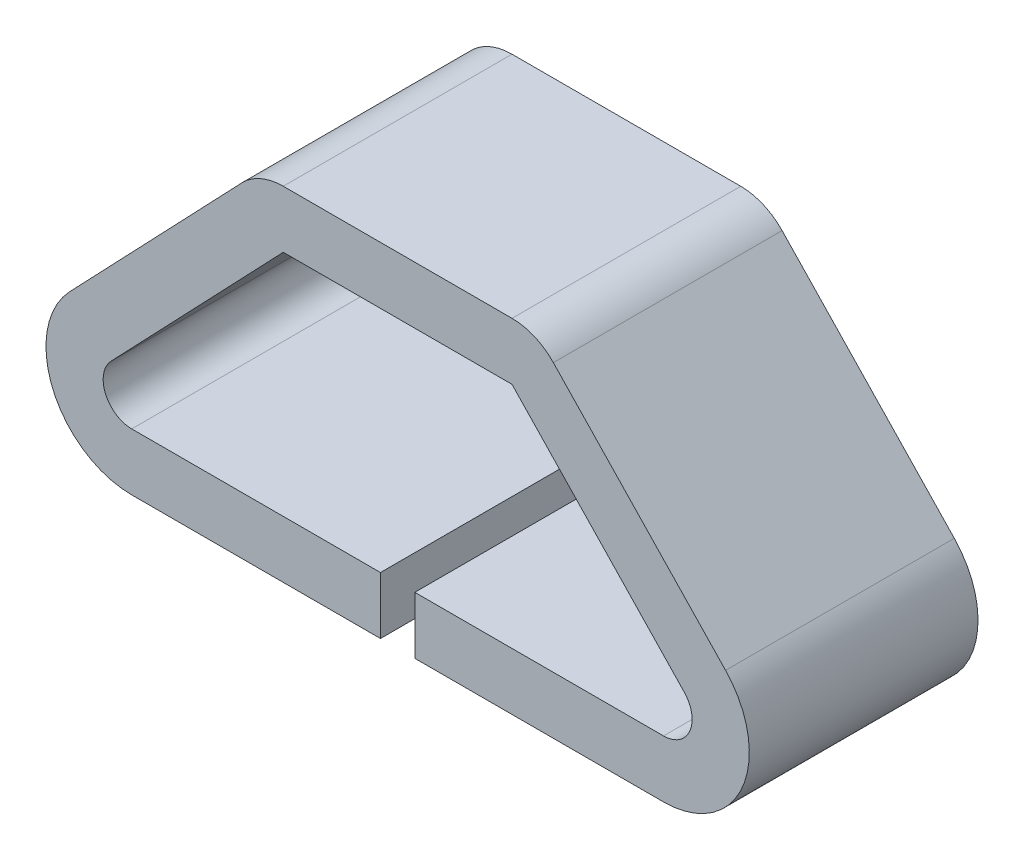
ISO-10303-21;
HEADER;
FILE_DESCRIPTION(('STEP AP214'),'2;1');
FILE_NAME('part.step','',(''),(''),'','','');
FILE_SCHEMA(('AUTOMOTIVE_DESIGN { 1 0 10303 214 1 1 1 1 }'));
ENDSEC;
DATA;
#1=APPLICATION_CONTEXT('core data for automotive mechanical design processes');
#2=APPLICATION_PROTOCOL_DEFINITION('international standard','automotive_design',2000,#1);
#3=PRODUCT_CONTEXT('',#1,'mechanical');
#4=PRODUCT('Part','Part','',(#3));
#5=PRODUCT_RELATED_PRODUCT_CATEGORY('part','',(#4));
#6=PRODUCT_DEFINITION_FORMATION('','',#4);
#7=PRODUCT_DEFINITION_CONTEXT('part definition',#1,'design');
#8=PRODUCT_DEFINITION('design','',#6,#7);
#9=PRODUCT_DEFINITION_SHAPE('','',#8);
#10=(LENGTH_UNIT() NAMED_UNIT(*) SI_UNIT(.MILLI.,.METRE.));
#11=(NAMED_UNIT(*) PLANE_ANGLE_UNIT() SI_UNIT($,.RADIAN.));
#12=(NAMED_UNIT(*) SI_UNIT($,.STERADIAN.) SOLID_ANGLE_UNIT());
#13=UNCERTAINTY_MEASURE_WITH_UNIT(LENGTH_MEASURE(1.E-05),#10,'distance_accuracy_value','');
#14=(GEOMETRIC_REPRESENTATION_CONTEXT(3) GLOBAL_UNCERTAINTY_ASSIGNED_CONTEXT((#13)) GLOBAL_UNIT_ASSIGNED_CONTEXT((#10,
#11,#12)) REPRESENTATION_CONTEXT('',''));
#15=CARTESIAN_POINT('',(0.,0.,0.));
#16=DIRECTION('',(0.,0.,1.));
#17=DIRECTION('',(1.,0.,0.));
#18=AXIS2_PLACEMENT_3D('',#15,#16,#17);
#19=CARTESIAN_POINT('',(1.1811,0.,-0.508));
#20=DIRECTION('',(0.,0.,1.));
#21=DIRECTION('',(1.,0.,0.));
#22=AXIS2_PLACEMENT_3D('',#19,#20,#21);
#23=PLANE('',#22);
#24=DIRECTION('',(1.,0.,0.));
#25=VECTOR('',#24,1.);
#26=CARTESIAN_POINT('',(1.1811,0.254000000000001,-0.508));
#27=LINE('',#26,#25);
#28=CARTESIAN_POINT('',(0.0762,0.254000000000001,-0.508));
#29=VERTEX_POINT('',#28);
#30=CARTESIAN_POINT('',(1.1811,0.254000000000001,-0.508));
#31=VERTEX_POINT('',#30);
#32=EDGE_CURVE('E145',#29,#31,#27,.T.);
#33=ORIENTED_EDGE('',*,*,#32,.T.);
#34=CARTESIAN_POINT('',(1.1811,0.381,-0.508));
#35=DIRECTION('',(0.,0.,1.));
#36=DIRECTION('',(1.,0.,0.));
#37=AXIS2_PLACEMENT_3D('',#34,#35,#36);
#38=CIRCLE('',#37,0.126999999999999);
#39=CARTESIAN_POINT('',(1.27296158843019,0.468695202668573,-0.508));
#40=VERTEX_POINT('',#39);
#41=EDGE_CURVE('E17',#31,#40,#38,.T.);
#42=ORIENTED_EDGE('',*,*,#41,.T.);
#43=DIRECTION('',(0.69051340683916,-0.723319593938514,0.));
#44=VECTOR('',#43,1.);
#45=CARTESIAN_POINT('',(1.27296158843019,0.468695202668573,-0.508));
#46=LINE('',#45,#44);
#47=CARTESIAN_POINT('',(0.507999999999999,1.27,-0.508));
#48=VERTEX_POINT('',#47);
#49=EDGE_CURVE('E216',#48,#40,#46,.T.);
#50=ORIENTED_EDGE('',*,*,#49,.F.);
#51=DIRECTION('',(1.,0.,0.));
#52=VECTOR('',#51,1.);
#53=CARTESIAN_POINT('',(0.507999999999999,1.27,-0.508));
#54=LINE('',#53,#52);
#55=CARTESIAN_POINT('',(-0.507999999999999,1.27,-0.508));
#56=VERTEX_POINT('',#55);
#57=EDGE_CURVE('E210',#56,#48,#54,.T.);
#58=ORIENTED_EDGE('',*,*,#57,.F.);
#59=DIRECTION('',(-0.69051340683916,-0.723319593938514,0.));
#60=VECTOR('',#59,1.);
#61=CARTESIAN_POINT('',(-1.27296158843019,0.468695202668573,-0.508));
#62=LINE('',#61,#60);
#63=CARTESIAN_POINT('',(-1.27296158843019,0.468695202668573,-0.508));
#64=VERTEX_POINT('',#63);
#65=EDGE_CURVE('E203',#56,#64,#62,.T.);
#66=ORIENTED_EDGE('',*,*,#65,.T.);
#67=CARTESIAN_POINT('',(-1.1811,0.381,-0.508));
#68=DIRECTION('',(0.,0.,-1.));
#69=DIRECTION('',(-1.,0.,0.));
#70=AXIS2_PLACEMENT_3D('',#67,#68,#69);
#71=CIRCLE('',#70,0.126999999999999);
#72=CARTESIAN_POINT('',(-1.1811,0.254000000000001,-0.508));
#73=VERTEX_POINT('',#72);
#74=EDGE_CURVE('E200',#64,#73,#71,.F.);
#75=ORIENTED_EDGE('',*,*,#74,.T.);
#76=DIRECTION('',(1.,0.,0.));
#77=VECTOR('',#76,1.);
#78=CARTESIAN_POINT('',(-1.1811,0.254000000000001,-0.508));
#79=LINE('',#78,#77);
#80=CARTESIAN_POINT('',(-0.0762,0.254000000000001,-0.508));
#81=VERTEX_POINT('',#80);
#82=EDGE_CURVE('E197',#81,#73,#79,.F.);
#83=ORIENTED_EDGE('',*,*,#82,.F.);
#84=DIRECTION('',(0.,1.,0.));
#85=VECTOR('',#84,1.);
#86=CARTESIAN_POINT('',(-0.0762,0.254000000000001,-0.508));
#87=LINE('',#86,#85);
#88=CARTESIAN_POINT('',(-0.0762,0.,-0.508));
#89=VERTEX_POINT('',#88);
#90=EDGE_CURVE('E192',#81,#89,#87,.F.);
#91=ORIENTED_EDGE('',*,*,#90,.T.);
#92=DIRECTION('',(1.,0.,0.));
#93=VECTOR('',#92,1.);
#94=CARTESIAN_POINT('',(-1.1811,0.,-0.508));
#95=LINE('',#94,#93);
#96=CARTESIAN_POINT('',(-1.1811,0.,-0.508));
#97=VERTEX_POINT('',#96);
#98=EDGE_CURVE('E185',#97,#89,#95,.T.);
#99=ORIENTED_EDGE('',*,*,#98,.F.);
#100=CARTESIAN_POINT('',(-1.1811,0.381,-0.508));
#101=DIRECTION('',(0.,0.,-1.));
#102=DIRECTION('',(-1.,0.,0.));
#103=AXIS2_PLACEMENT_3D('',#100,#101,#102);
#104=CIRCLE('',#103,0.381);
#105=CARTESIAN_POINT('',(-1.45668476529057,0.64408560800572,-0.508));
#106=VERTEX_POINT('',#105);
#107=EDGE_CURVE('E184',#106,#97,#104,.F.);
#108=ORIENTED_EDGE('',*,*,#107,.F.);
#109=DIRECTION('',(0.69051340683916,0.723319593938514,0.));
#110=VECTOR('',#109,1.);
#111=CARTESIAN_POINT('',(-1.45668476529057,0.64408560800572,-0.508));
#112=LINE('',#111,#110);
#113=CARTESIAN_POINT('',(-0.691723176860383,1.44539040533715,-0.508));
#114=VERTEX_POINT('',#113);
#115=EDGE_CURVE('E181',#106,#114,#112,.T.);
#116=ORIENTED_EDGE('',*,*,#115,.T.);
#117=CARTESIAN_POINT('',(-0.508,1.27,-0.508));
#118=DIRECTION('',(0.,0.,-1.));
#119=DIRECTION('',(-1.,0.,0.));
#120=AXIS2_PLACEMENT_3D('',#117,#118,#119);
#121=CIRCLE('',#120,0.254);
#122=CARTESIAN_POINT('',(-0.508,1.524,-0.508));
#123=VERTEX_POINT('',#122);
#124=EDGE_CURVE('E180',#123,#114,#121,.F.);
#125=ORIENTED_EDGE('',*,*,#124,.F.);
#126=DIRECTION('',(-1.,0.,0.));
#127=VECTOR('',#126,1.);
#128=CARTESIAN_POINT('',(0.508,1.524,-0.508));
#129=LINE('',#128,#127);
#130=CARTESIAN_POINT('',(0.508,1.524,-0.508));
#131=VERTEX_POINT('',#130);
#132=EDGE_CURVE('E177',#131,#123,#129,.T.);
#133=ORIENTED_EDGE('',*,*,#132,.F.);
#134=CARTESIAN_POINT('',(0.508,1.27,-0.508));
#135=DIRECTION('',(0.,0.,1.));
#136=DIRECTION('',(1.,0.,0.));
#137=AXIS2_PLACEMENT_3D('',#134,#135,#136);
#138=CIRCLE('',#137,0.254);
#139=CARTESIAN_POINT('',(0.691723176860383,1.44539040533715,-0.508));
#140=VERTEX_POINT('',#139);
#141=EDGE_CURVE('E244',#140,#131,#138,.T.);
#142=ORIENTED_EDGE('',*,*,#141,.F.);
#143=DIRECTION('',(-0.69051340683916,0.723319593938514,0.));
#144=VECTOR('',#143,1.);
#145=CARTESIAN_POINT('',(1.45668476529057,0.64408560800572,-0.508));
#146=LINE('',#145,#144);
#147=CARTESIAN_POINT('',(1.45668476529057,0.64408560800572,-0.508));
#148=VERTEX_POINT('',#147);
#149=EDGE_CURVE('E173',#148,#140,#146,.T.);
#150=ORIENTED_EDGE('',*,*,#149,.F.);
#151=CARTESIAN_POINT('',(1.1811,0.381,-0.508));
#152=DIRECTION('',(0.,0.,1.));
#153=DIRECTION('',(1.,0.,0.));
#154=AXIS2_PLACEMENT_3D('',#151,#152,#153);
#155=CIRCLE('',#154,0.381);
#156=CARTESIAN_POINT('',(1.1811,0.,-0.508));
#157=VERTEX_POINT('',#156);
#158=EDGE_CURVE('E241',#157,#148,#155,.T.);
#159=ORIENTED_EDGE('',*,*,#158,.F.);
#160=DIRECTION('',(1.,0.,0.));
#161=VECTOR('',#160,1.);
#162=CARTESIAN_POINT('',(1.1811,0.,-0.508));
#163=LINE('',#162,#161);
#164=CARTESIAN_POINT('',(0.0762,0.,-0.508));
#165=VERTEX_POINT('',#164);
#166=EDGE_CURVE('E168',#157,#165,#163,.F.);
#167=ORIENTED_EDGE('',*,*,#166,.T.);
#168=DIRECTION('',(0.,1.,0.));
#169=VECTOR('',#168,1.);
#170=CARTESIAN_POINT('',(0.0762,0.254000000000001,-0.508));
#171=LINE('',#170,#169);
#172=EDGE_CURVE('E146',#165,#29,#171,.T.);
#173=ORIENTED_EDGE('',*,*,#172,.T.);
#174=EDGE_LOOP('',(#33,#42,#50,#58,#66,#75,#83,#91,#99,#108,#116,#125,#133,#142,#150,#159,#167,#173));
#175=FACE_BOUND('',#174,.T.);
#176=ADVANCED_FACE('F14',(#175),#23,.F.);
#177=CARTESIAN_POINT('',(1.1811,0.254000000000001,-0.508));
#178=DIRECTION('',(0.,-1.,0.));
#179=DIRECTION('',(0.,0.,-1.));
#180=AXIS2_PLACEMENT_3D('',#177,#178,#179);
#181=PLANE('',#180);
#182=DIRECTION('',(-1.,0.,0.));
#183=VECTOR('',#182,1.);
#184=CARTESIAN_POINT('',(1.1811,0.254000000000001,0.508));
#185=LINE('',#184,#183);
#186=CARTESIAN_POINT('',(0.0762,0.254000000000001,0.508));
#187=VERTEX_POINT('',#186);
#188=CARTESIAN_POINT('',(1.1811,0.254000000000001,0.508));
#189=VERTEX_POINT('',#188);
#190=EDGE_CURVE('E154',#187,#189,#185,.F.);
#191=ORIENTED_EDGE('',*,*,#190,.T.);
#192=DIRECTION('',(0.,0.,1.));
#193=VECTOR('',#192,1.);
#194=CARTESIAN_POINT('',(1.1811,0.254000000000001,0.));
#195=LINE('',#194,#193);
#196=EDGE_CURVE('E140',#189,#31,#195,.F.);
#197=ORIENTED_EDGE('',*,*,#196,.T.);
#198=ORIENTED_EDGE('',*,*,#32,.F.);
#199=DIRECTION('',(0.,0.,-1.));
#200=VECTOR('',#199,1.);
#201=CARTESIAN_POINT('',(0.0762,0.254000000000001,0.508));
#202=LINE('',#201,#200);
#203=EDGE_CURVE('E159',#29,#187,#202,.F.);
#204=ORIENTED_EDGE('',*,*,#203,.T.);
#205=EDGE_LOOP('',(#191,#197,#198,#204));
#206=FACE_BOUND('',#205,.T.);
#207=ADVANCED_FACE('F152',(#206),#181,.F.);
#208=CARTESIAN_POINT('',(1.1811,0.381,0.));
#209=DIRECTION('',(0.,0.,1.));
#210=DIRECTION('',(1.,0.,0.));
#211=AXIS2_PLACEMENT_3D('',#208,#209,#210);
#212=CYLINDRICAL_SURFACE('',#211,0.126999999999999);
#213=ORIENTED_EDGE('',*,*,#41,.F.);
#214=ORIENTED_EDGE('',*,*,#196,.F.);
#215=CARTESIAN_POINT('',(1.1811,0.381,0.508));
#216=DIRECTION('',(0.,0.,1.));
#217=DIRECTION('',(1.,0.,0.));
#218=AXIS2_PLACEMENT_3D('',#215,#216,#217);
#219=CIRCLE('',#218,0.126999999999999);
#220=CARTESIAN_POINT('',(1.27296158843019,0.468695202668573,0.508));
#221=VERTEX_POINT('',#220);
#222=EDGE_CURVE('E238',#189,#221,#219,.T.);
#223=ORIENTED_EDGE('',*,*,#222,.T.);
#224=DIRECTION('',(0.,0.,1.));
#225=VECTOR('',#224,1.);
#226=CARTESIAN_POINT('',(1.27296158843019,0.468695202668573,-0.508));
#227=LINE('',#226,#225);
#228=EDGE_CURVE('E143',#40,#221,#227,.T.);
#229=ORIENTED_EDGE('',*,*,#228,.F.);
#230=EDGE_LOOP('',(#213,#214,#223,#229));
#231=FACE_BOUND('',#230,.T.);
#232=ADVANCED_FACE('F138',(#231),#212,.F.);
#233=CARTESIAN_POINT('',(1.27296158843019,0.468695202668573,-0.508));
#234=DIRECTION('',(-0.723319593938514,-0.69051340683916,0.));
#235=DIRECTION('',(0.69051340683916,-0.723319593938514,0.));
#236=AXIS2_PLACEMENT_3D('',#233,#234,#235);
#237=PLANE('',#236);
#238=DIRECTION('',(0.,0.,1.));
#239=VECTOR('',#238,1.);
#240=CARTESIAN_POINT('',(0.507999999999999,1.27,-0.508));
#241=LINE('',#240,#239);
#242=CARTESIAN_POINT('',(0.507999999999999,1.27,0.508));
#243=VERTEX_POINT('',#242);
#244=EDGE_CURVE('E213',#48,#243,#241,.T.);
#245=ORIENTED_EDGE('',*,*,#244,.F.);
#246=ORIENTED_EDGE('',*,*,#49,.T.);
#247=ORIENTED_EDGE('',*,*,#228,.T.);
#248=DIRECTION('',(-0.69051340683916,0.723319593938514,0.));
#249=VECTOR('',#248,1.);
#250=CARTESIAN_POINT('',(1.27296158843019,0.468695202668573,0.508));
#251=LINE('',#250,#249);
#252=EDGE_CURVE('E240',#221,#243,#251,.T.);
#253=ORIENTED_EDGE('',*,*,#252,.T.);
#254=EDGE_LOOP('',(#245,#246,#247,#253));
#255=FACE_BOUND('',#254,.T.);
#256=ADVANCED_FACE('F281',(#255),#237,.T.);
#257=CARTESIAN_POINT('',(0.507999999999999,1.27,-0.508));
#258=DIRECTION('',(0.,-1.,0.));
#259=DIRECTION('',(1.,0.,0.));
#260=AXIS2_PLACEMENT_3D('',#257,#258,#259);
#261=PLANE('',#260);
#262=DIRECTION('',(0.,0.,1.));
#263=VECTOR('',#262,1.);
#264=CARTESIAN_POINT('',(-0.507999999999999,1.27,-0.508));
#265=LINE('',#264,#263);
#266=CARTESIAN_POINT('',(-0.507999999999999,1.27,0.508));
#267=VERTEX_POINT('',#266);
#268=EDGE_CURVE('E207',#267,#56,#265,.F.);
#269=ORIENTED_EDGE('',*,*,#268,.T.);
#270=ORIENTED_EDGE('',*,*,#57,.T.);
#271=ORIENTED_EDGE('',*,*,#244,.T.);
#272=DIRECTION('',(-1.,0.,0.));
#273=VECTOR('',#272,1.);
#274=CARTESIAN_POINT('',(1.1811,1.27,0.508));
#275=LINE('',#274,#273);
#276=EDGE_CURVE('E263',#243,#267,#275,.T.);
#277=ORIENTED_EDGE('',*,*,#276,.T.);
#278=EDGE_LOOP('',(#269,#270,#271,#277));
#279=FACE_BOUND('',#278,.T.);
#280=ADVANCED_FACE('F272',(#279),#261,.T.);
#281=CARTESIAN_POINT('',(-1.27296158843019,0.468695202668573,-0.508));
#282=DIRECTION('',(-0.723319593938514,0.69051340683916,0.));
#283=DIRECTION('',(-0.69051340683916,-0.723319593938514,0.));
#284=AXIS2_PLACEMENT_3D('',#281,#282,#283);
#285=PLANE('',#284);
#286=ORIENTED_EDGE('',*,*,#65,.F.);
#287=ORIENTED_EDGE('',*,*,#268,.F.);
#288=DIRECTION('',(-0.69051340683916,-0.723319593938514,0.));
#289=VECTOR('',#288,1.);
#290=CARTESIAN_POINT('',(-0.507999999999999,1.27,0.508));
#291=LINE('',#290,#289);
#292=CARTESIAN_POINT('',(-1.27296158843019,0.468695202668573,0.508));
#293=VERTEX_POINT('',#292);
#294=EDGE_CURVE('E237',#267,#293,#291,.T.);
#295=ORIENTED_EDGE('',*,*,#294,.T.);
#296=DIRECTION('',(0.,0.,-1.));
#297=VECTOR('',#296,1.);
#298=CARTESIAN_POINT('',(-1.27296158843019,0.468695202668573,0.));
#299=LINE('',#298,#297);
#300=EDGE_CURVE('E206',#293,#64,#299,.T.);
#301=ORIENTED_EDGE('',*,*,#300,.T.);
#302=EDGE_LOOP('',(#286,#287,#295,#301));
#303=FACE_BOUND('',#302,.T.);
#304=ADVANCED_FACE('F331',(#303),#285,.F.);
#305=CARTESIAN_POINT('',(-1.1811,0.381,0.));
#306=DIRECTION('',(0.,0.,-1.));
#307=DIRECTION('',(-1.,0.,0.));
#308=AXIS2_PLACEMENT_3D('',#305,#306,#307);
#309=CYLINDRICAL_SURFACE('',#308,0.126999999999999);
#310=CARTESIAN_POINT('',(-1.1811,0.381,0.508));
#311=DIRECTION('',(0.,0.,-1.));
#312=DIRECTION('',(-1.,0.,0.));
#313=AXIS2_PLACEMENT_3D('',#310,#311,#312);
#314=CIRCLE('',#313,0.126999999999999);
#315=CARTESIAN_POINT('',(-1.1811,0.254000000000001,0.508));
#316=VERTEX_POINT('',#315);
#317=EDGE_CURVE('E234',#293,#316,#314,.F.);
#318=ORIENTED_EDGE('',*,*,#317,.T.);
#319=DIRECTION('',(0.,0.,1.));
#320=VECTOR('',#319,1.);
#321=CARTESIAN_POINT('',(-1.1811,0.254000000000001,-0.508));
#322=LINE('',#321,#320);
#323=EDGE_CURVE('E199',#73,#316,#322,.T.);
#324=ORIENTED_EDGE('',*,*,#323,.F.);
#325=ORIENTED_EDGE('',*,*,#74,.F.);
#326=ORIENTED_EDGE('',*,*,#300,.F.);
#327=EDGE_LOOP('',(#318,#324,#325,#326));
#328=FACE_BOUND('',#327,.T.);
#329=ADVANCED_FACE('F333',(#328),#309,.F.);
#330=CARTESIAN_POINT('',(-1.1811,0.254000000000001,-0.508));
#331=DIRECTION('',(0.,1.,0.));
#332=DIRECTION('',(0.,0.,1.));
#333=AXIS2_PLACEMENT_3D('',#330,#331,#332);
#334=PLANE('',#333);
#335=ORIENTED_EDGE('',*,*,#323,.T.);
#336=DIRECTION('',(-1.,0.,0.));
#337=VECTOR('',#336,1.);
#338=CARTESIAN_POINT('',(1.1811,0.254000000000001,0.508));
#339=LINE('',#338,#337);
#340=CARTESIAN_POINT('',(-0.0762,0.254000000000001,0.508));
#341=VERTEX_POINT('',#340);
#342=EDGE_CURVE('E236',#316,#341,#339,.F.);
#343=ORIENTED_EDGE('',*,*,#342,.T.);
#344=DIRECTION('',(0.,0.,1.));
#345=VECTOR('',#344,1.);
#346=CARTESIAN_POINT('',(-0.0762,0.254000000000001,0.508));
#347=LINE('',#346,#345);
#348=EDGE_CURVE('E194',#341,#81,#347,.F.);
#349=ORIENTED_EDGE('',*,*,#348,.T.);
#350=ORIENTED_EDGE('',*,*,#82,.T.);
#351=EDGE_LOOP('',(#335,#343,#349,#350));
#352=FACE_BOUND('',#351,.T.);
#353=ADVANCED_FACE('F321',(#352),#334,.T.);
#354=CARTESIAN_POINT('',(-0.0762,0.254000000000001,0.508));
#355=DIRECTION('',(-1.,0.,0.));
#356=DIRECTION('',(0.,0.,1.));
#357=AXIS2_PLACEMENT_3D('',#354,#355,#356);
#358=PLANE('',#357);
#359=DIRECTION('',(0.,0.,-1.));
#360=VECTOR('',#359,1.);
#361=CARTESIAN_POINT('',(-0.0762,0.,0.508));
#362=LINE('',#361,#360);
#363=CARTESIAN_POINT('',(-0.0762,0.,0.508));
#364=VERTEX_POINT('',#363);
#365=EDGE_CURVE('E189',#89,#364,#362,.F.);
#366=ORIENTED_EDGE('',*,*,#365,.F.);
#367=ORIENTED_EDGE('',*,*,#90,.F.);
#368=ORIENTED_EDGE('',*,*,#348,.F.);
#369=DIRECTION('',(0.,1.,0.));
#370=VECTOR('',#369,1.);
#371=CARTESIAN_POINT('',(-0.0762,0.,0.508));
#372=LINE('',#371,#370);
#373=EDGE_CURVE('E310',#341,#364,#372,.F.);
#374=ORIENTED_EDGE('',*,*,#373,.T.);
#375=EDGE_LOOP('',(#366,#367,#368,#374));
#376=FACE_BOUND('',#375,.T.);
#377=ADVANCED_FACE('F385',(#376),#358,.F.);
#378=CARTESIAN_POINT('',(-1.1811,0.,0.508));
#379=DIRECTION('',(0.,-1.,0.));
#380=DIRECTION('',(0.,0.,-1.));
#381=AXIS2_PLACEMENT_3D('',#378,#379,#380);
#382=PLANE('',#381);
#383=DIRECTION('',(0.,0.,-1.));
#384=VECTOR('',#383,1.);
#385=CARTESIAN_POINT('',(-1.1811,0.,0.));
#386=LINE('',#385,#384);
#387=CARTESIAN_POINT('',(-1.1811,0.,0.508));
#388=VERTEX_POINT('',#387);
#389=EDGE_CURVE('E188',#97,#388,#386,.F.);
#390=ORIENTED_EDGE('',*,*,#389,.F.);
#391=ORIENTED_EDGE('',*,*,#98,.T.);
#392=ORIENTED_EDGE('',*,*,#365,.T.);
#393=DIRECTION('',(-1.,0.,0.));
#394=VECTOR('',#393,1.);
#395=CARTESIAN_POINT('',(1.1811,0.,0.508));
#396=LINE('',#395,#394);
#397=EDGE_CURVE('E233',#364,#388,#396,.T.);
#398=ORIENTED_EDGE('',*,*,#397,.T.);
#399=EDGE_LOOP('',(#390,#391,#392,#398));
#400=FACE_BOUND('',#399,.T.);
#401=ADVANCED_FACE('F381',(#400),#382,.T.);
#402=CARTESIAN_POINT('',(-1.1811,0.381,0.));
#403=DIRECTION('',(0.,0.,-1.));
#404=DIRECTION('',(-1.,0.,0.));
#405=AXIS2_PLACEMENT_3D('',#402,#403,#404);
#406=CYLINDRICAL_SURFACE('',#405,0.381);
#407=DIRECTION('',(0.,0.,1.));
#408=VECTOR('',#407,1.);
#409=CARTESIAN_POINT('',(-1.45668476529057,0.64408560800572,0.508));
#410=LINE('',#409,#408);
#411=CARTESIAN_POINT('',(-1.45668476529057,0.64408560800572,0.508));
#412=VERTEX_POINT('',#411);
#413=EDGE_CURVE('E183',#412,#106,#410,.F.);
#414=ORIENTED_EDGE('',*,*,#413,.T.);
#415=ORIENTED_EDGE('',*,*,#107,.T.);
#416=ORIENTED_EDGE('',*,*,#389,.T.);
#417=CARTESIAN_POINT('',(-1.1811,0.381,0.508));
#418=DIRECTION('',(0.,0.,-1.));
#419=DIRECTION('',(-1.,0.,0.));
#420=AXIS2_PLACEMENT_3D('',#417,#418,#419);
#421=CIRCLE('',#420,0.381);
#422=EDGE_CURVE('E231',#388,#412,#421,.T.);
#423=ORIENTED_EDGE('',*,*,#422,.T.);
#424=EDGE_LOOP('',(#414,#415,#416,#423));
#425=FACE_BOUND('',#424,.T.);
#426=ADVANCED_FACE('F377',(#425),#406,.T.);
#427=CARTESIAN_POINT('',(-1.45668476529057,0.64408560800572,0.508));
#428=DIRECTION('',(0.723319593938514,-0.69051340683916,0.));
#429=DIRECTION('',(0.69051340683916,0.723319593938514,0.));
#430=AXIS2_PLACEMENT_3D('',#427,#428,#429);
#431=PLANE('',#430);
#432=DIRECTION('',(0.69051340683916,0.723319593938514,0.));
#433=VECTOR('',#432,1.);
#434=CARTESIAN_POINT('',(-1.45668476529057,0.64408560800572,0.508));
#435=LINE('',#434,#433);
#436=CARTESIAN_POINT('',(-0.691723176860383,1.44539040533715,0.508));
#437=VERTEX_POINT('',#436);
#438=EDGE_CURVE('E230',#412,#437,#435,.T.);
#439=ORIENTED_EDGE('',*,*,#438,.T.);
#440=DIRECTION('',(0.,0.,-1.));
#441=VECTOR('',#440,1.);
#442=CARTESIAN_POINT('',(-0.691723176860383,1.44539040533715,0.));
#443=LINE('',#442,#441);
#444=EDGE_CURVE('E248',#114,#437,#443,.F.);
#445=ORIENTED_EDGE('',*,*,#444,.F.);
#446=ORIENTED_EDGE('',*,*,#115,.F.);
#447=ORIENTED_EDGE('',*,*,#413,.F.);
#448=EDGE_LOOP('',(#439,#445,#446,#447));
#449=FACE_BOUND('',#448,.T.);
#450=ADVANCED_FACE('F373',(#449),#431,.F.);
#451=CARTESIAN_POINT('',(-0.508,1.27,0.));
#452=DIRECTION('',(0.,0.,-1.));
#453=DIRECTION('',(-1.,0.,0.));
#454=AXIS2_PLACEMENT_3D('',#451,#452,#453);
#455=CYLINDRICAL_SURFACE('',#454,0.254);
#456=DIRECTION('',(0.,0.,1.));
#457=VECTOR('',#456,1.);
#458=CARTESIAN_POINT('',(-0.508,1.524,0.508));
#459=LINE('',#458,#457);
#460=CARTESIAN_POINT('',(-0.508,1.524,0.508));
#461=VERTEX_POINT('',#460);
#462=EDGE_CURVE('E179',#123,#461,#459,.T.);
#463=ORIENTED_EDGE('',*,*,#462,.F.);
#464=ORIENTED_EDGE('',*,*,#124,.T.);
#465=ORIENTED_EDGE('',*,*,#444,.T.);
#466=CARTESIAN_POINT('',(-0.508,1.27,0.508));
#467=DIRECTION('',(0.,0.,-1.));
#468=DIRECTION('',(-1.,0.,0.));
#469=AXIS2_PLACEMENT_3D('',#466,#467,#468);
#470=CIRCLE('',#469,0.254);
#471=EDGE_CURVE('E227',#437,#461,#470,.T.);
#472=ORIENTED_EDGE('',*,*,#471,.T.);
#473=EDGE_LOOP('',(#463,#464,#465,#472));
#474=FACE_BOUND('',#473,.T.);
#475=ADVANCED_FACE('F369',(#474),#455,.T.);
#476=CARTESIAN_POINT('',(0.508,1.524,0.508));
#477=DIRECTION('',(0.,1.,0.));
#478=DIRECTION('',(-1.,0.,0.));
#479=AXIS2_PLACEMENT_3D('',#476,#477,#478);
#480=PLANE('',#479);
#481=ORIENTED_EDGE('',*,*,#462,.T.);
#482=DIRECTION('',(-1.,0.,0.));
#483=VECTOR('',#482,1.);
#484=CARTESIAN_POINT('',(1.1811,1.524,0.508));
#485=LINE('',#484,#483);
#486=CARTESIAN_POINT('',(0.508,1.524,0.508));
#487=VERTEX_POINT('',#486);
#488=EDGE_CURVE('E226',#461,#487,#485,.F.);
#489=ORIENTED_EDGE('',*,*,#488,.T.);
#490=DIRECTION('',(0.,0.,1.));
#491=VECTOR('',#490,1.);
#492=CARTESIAN_POINT('',(0.508,1.524,0.));
#493=LINE('',#492,#491);
#494=EDGE_CURVE('E176',#131,#487,#493,.T.);
#495=ORIENTED_EDGE('',*,*,#494,.F.);
#496=ORIENTED_EDGE('',*,*,#132,.T.);
#497=EDGE_LOOP('',(#481,#489,#495,#496));
#498=FACE_BOUND('',#497,.T.);
#499=ADVANCED_FACE('F365',(#498),#480,.T.);
#500=CARTESIAN_POINT('',(0.508,1.27,0.));
#501=DIRECTION('',(0.,0.,1.));
#502=DIRECTION('',(1.,0.,0.));
#503=AXIS2_PLACEMENT_3D('',#500,#501,#502);
#504=CYLINDRICAL_SURFACE('',#503,0.254);
#505=ORIENTED_EDGE('',*,*,#494,.T.);
#506=CARTESIAN_POINT('',(0.508,1.27,0.508));
#507=DIRECTION('',(0.,0.,1.));
#508=DIRECTION('',(1.,0.,0.));
#509=AXIS2_PLACEMENT_3D('',#506,#507,#508);
#510=CIRCLE('',#509,0.254);
#511=CARTESIAN_POINT('',(0.691723176860383,1.44539040533715,0.508));
#512=VERTEX_POINT('',#511);
#513=EDGE_CURVE('E223',#487,#512,#510,.F.);
#514=ORIENTED_EDGE('',*,*,#513,.T.);
#515=DIRECTION('',(0.,0.,1.));
#516=VECTOR('',#515,1.);
#517=CARTESIAN_POINT('',(0.691723176860383,1.44539040533715,0.508));
#518=LINE('',#517,#516);
#519=EDGE_CURVE('E175',#140,#512,#518,.T.);
#520=ORIENTED_EDGE('',*,*,#519,.F.);
#521=ORIENTED_EDGE('',*,*,#141,.T.);
#522=EDGE_LOOP('',(#505,#514,#520,#521));
#523=FACE_BOUND('',#522,.T.);
#524=ADVANCED_FACE('F361',(#523),#504,.T.);
#525=CARTESIAN_POINT('',(1.45668476529057,0.64408560800572,0.508));
#526=DIRECTION('',(0.723319593938514,0.69051340683916,0.));
#527=DIRECTION('',(-0.69051340683916,0.723319593938514,0.));
#528=AXIS2_PLACEMENT_3D('',#525,#526,#527);
#529=PLANE('',#528);
#530=ORIENTED_EDGE('',*,*,#519,.T.);
#531=DIRECTION('',(0.69051340683916,-0.723319593938514,0.));
#532=VECTOR('',#531,1.);
#533=CARTESIAN_POINT('',(0.691723176860383,1.44539040533715,0.508));
#534=LINE('',#533,#532);
#535=CARTESIAN_POINT('',(1.45668476529057,0.64408560800572,0.508));
#536=VERTEX_POINT('',#535);
#537=EDGE_CURVE('E222',#512,#536,#534,.T.);
#538=ORIENTED_EDGE('',*,*,#537,.T.);
#539=DIRECTION('',(0.,0.,1.));
#540=VECTOR('',#539,1.);
#541=CARTESIAN_POINT('',(1.45668476529057,0.64408560800572,0.));
#542=LINE('',#541,#540);
#543=EDGE_CURVE('E243',#148,#536,#542,.T.);
#544=ORIENTED_EDGE('',*,*,#543,.F.);
#545=ORIENTED_EDGE('',*,*,#149,.T.);
#546=EDGE_LOOP('',(#530,#538,#544,#545));
#547=FACE_BOUND('',#546,.T.);
#548=ADVANCED_FACE('F357',(#547),#529,.T.);
#549=CARTESIAN_POINT('',(1.1811,0.381,0.));
#550=DIRECTION('',(0.,0.,1.));
#551=DIRECTION('',(1.,0.,0.));
#552=AXIS2_PLACEMENT_3D('',#549,#550,#551);
#553=CYLINDRICAL_SURFACE('',#552,0.381);
#554=CARTESIAN_POINT('',(1.1811,0.381,0.508));
#555=DIRECTION('',(0.,0.,1.));
#556=DIRECTION('',(1.,0.,0.));
#557=AXIS2_PLACEMENT_3D('',#554,#555,#556);
#558=CIRCLE('',#557,0.381);
#559=CARTESIAN_POINT('',(1.1811,0.,0.508));
#560=VERTEX_POINT('',#559);
#561=EDGE_CURVE('E220',#536,#560,#558,.F.);
#562=ORIENTED_EDGE('',*,*,#561,.T.);
#563=DIRECTION('',(0.,0.,1.));
#564=VECTOR('',#563,1.);
#565=CARTESIAN_POINT('',(1.1811,0.,0.508));
#566=LINE('',#565,#564);
#567=EDGE_CURVE('E170',#560,#157,#566,.F.);
#568=ORIENTED_EDGE('',*,*,#567,.T.);
#569=ORIENTED_EDGE('',*,*,#158,.T.);
#570=ORIENTED_EDGE('',*,*,#543,.T.);
#571=EDGE_LOOP('',(#562,#568,#569,#570));
#572=FACE_BOUND('',#571,.T.);
#573=ADVANCED_FACE('F353',(#572),#553,.T.);
#574=CARTESIAN_POINT('',(1.1811,0.,0.508));
#575=DIRECTION('',(0.,1.,0.));
#576=DIRECTION('',(0.,0.,1.));
#577=AXIS2_PLACEMENT_3D('',#574,#575,#576);
#578=PLANE('',#577);
#579=ORIENTED_EDGE('',*,*,#166,.F.);
#580=ORIENTED_EDGE('',*,*,#567,.F.);
#581=DIRECTION('',(-1.,0.,0.));
#582=VECTOR('',#581,1.);
#583=CARTESIAN_POINT('',(1.1811,0.,0.508));
#584=LINE('',#583,#582);
#585=CARTESIAN_POINT('',(0.0762,0.,0.508));
#586=VERTEX_POINT('',#585);
#587=EDGE_CURVE('E23',#560,#586,#584,.T.);
#588=ORIENTED_EDGE('',*,*,#587,.T.);
#589=DIRECTION('',(0.,0.,-1.));
#590=VECTOR('',#589,1.);
#591=CARTESIAN_POINT('',(0.0762,0.,0.508));
#592=LINE('',#591,#590);
#593=EDGE_CURVE('E31',#586,#165,#592,.T.);
#594=ORIENTED_EDGE('',*,*,#593,.T.);
#595=EDGE_LOOP('',(#579,#580,#588,#594));
#596=FACE_BOUND('',#595,.T.);
#597=ADVANCED_FACE('F348',(#596),#578,.F.);
#598=CARTESIAN_POINT('',(0.0762,0.254000000000001,0.508));
#599=DIRECTION('',(1.,0.,0.));
#600=DIRECTION('',(0.,0.,-1.));
#601=AXIS2_PLACEMENT_3D('',#598,#599,#600);
#602=PLANE('',#601);
#603=ORIENTED_EDGE('',*,*,#203,.F.);
#604=ORIENTED_EDGE('',*,*,#172,.F.);
#605=ORIENTED_EDGE('',*,*,#593,.F.);
#606=DIRECTION('',(0.,1.,0.));
#607=VECTOR('',#606,1.);
#608=CARTESIAN_POINT('',(0.0762,0.,0.508));
#609=LINE('',#608,#607);
#610=EDGE_CURVE('E9',#586,#187,#609,.T.);
#611=ORIENTED_EDGE('',*,*,#610,.T.);
#612=EDGE_LOOP('',(#603,#604,#605,#611));
#613=FACE_BOUND('',#612,.T.);
#614=ADVANCED_FACE('F343',(#613),#602,.F.);
#615=CARTESIAN_POINT('',(1.1811,0.,0.508));
#616=DIRECTION('',(0.,0.,-1.));
#617=DIRECTION('',(-1.,0.,0.));
#618=AXIS2_PLACEMENT_3D('',#615,#616,#617);
#619=PLANE('',#618);
#620=ORIENTED_EDGE('',*,*,#587,.F.);
#621=ORIENTED_EDGE('',*,*,#561,.F.);
#622=ORIENTED_EDGE('',*,*,#537,.F.);
#623=ORIENTED_EDGE('',*,*,#513,.F.);
#624=ORIENTED_EDGE('',*,*,#488,.F.);
#625=ORIENTED_EDGE('',*,*,#471,.F.);
#626=ORIENTED_EDGE('',*,*,#438,.F.);
#627=ORIENTED_EDGE('',*,*,#422,.F.);
#628=ORIENTED_EDGE('',*,*,#397,.F.);
#629=ORIENTED_EDGE('',*,*,#373,.F.);
#630=ORIENTED_EDGE('',*,*,#342,.F.);
#631=ORIENTED_EDGE('',*,*,#317,.F.);
#632=ORIENTED_EDGE('',*,*,#294,.F.);
#633=ORIENTED_EDGE('',*,*,#276,.F.);
#634=ORIENTED_EDGE('',*,*,#252,.F.);
#635=ORIENTED_EDGE('',*,*,#222,.F.);
#636=ORIENTED_EDGE('',*,*,#190,.F.);
#637=ORIENTED_EDGE('',*,*,#610,.F.);
#638=EDGE_LOOP('',(#620,#621,#622,#623,#624,#625,#626,#627,#628,#629,#630,#631,#632,#633,#634,
#635,#636,#637));
#639=FACE_BOUND('',#638,.T.);
#640=ADVANCED_FACE('F279',(#639),#619,.F.);
#641=CLOSED_SHELL('',(#176,#207,#232,#256,#280,#304,#329,#353,#377,#401,#426,#450,#475,#499,
#524,#548,#573,#597,#614,#640));
#642=MANIFOLD_SOLID_BREP('B1',#641);
#643=ADVANCED_BREP_SHAPE_REPRESENTATION('',(#18,#642),#14);
#644=SHAPE_DEFINITION_REPRESENTATION(#9,#643);
ENDSEC;
END-ISO-10303-21;
